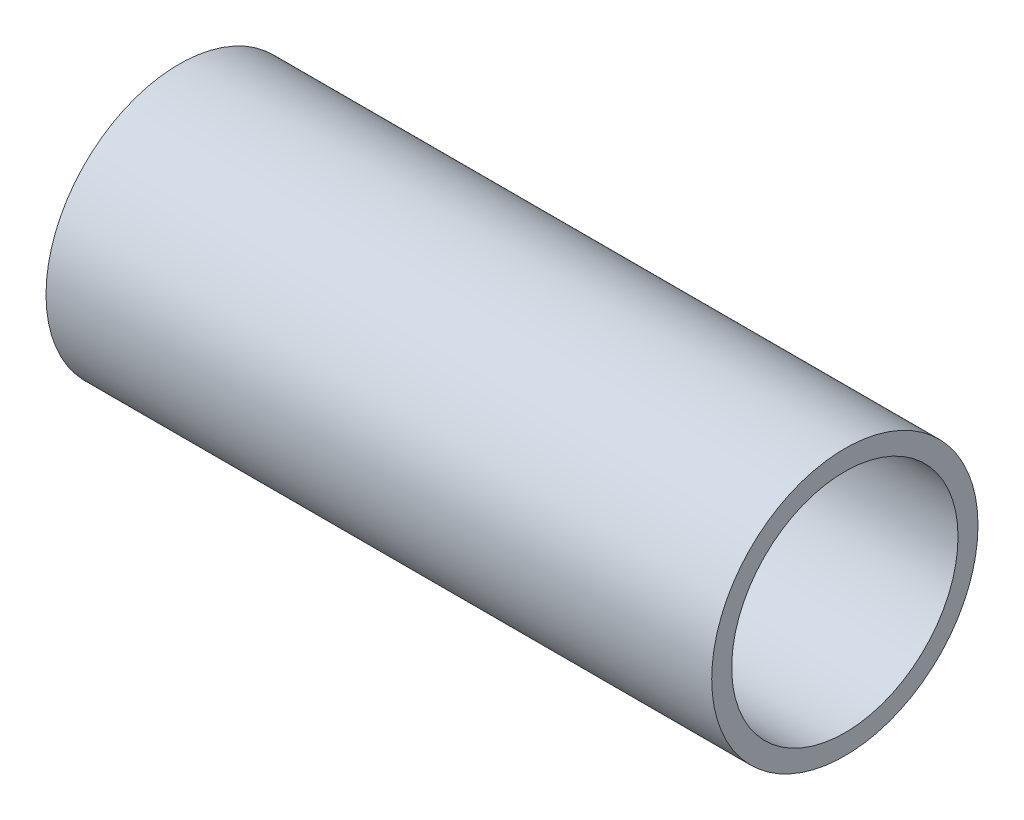
ISO-10303-21;
HEADER;
FILE_DESCRIPTION(('STEP AP214'),'2;1');
FILE_NAME('part.step','',(''),(''),'','','');
FILE_SCHEMA(('AUTOMOTIVE_DESIGN { 1 0 10303 214 1 1 1 1 }'));
ENDSEC;
DATA;
#1=APPLICATION_CONTEXT('core data for automotive mechanical design processes');
#2=APPLICATION_PROTOCOL_DEFINITION('international standard','automotive_design',2000,#1);
#3=PRODUCT_CONTEXT('',#1,'mechanical');
#4=PRODUCT('Part','Part','',(#3));
#5=PRODUCT_RELATED_PRODUCT_CATEGORY('part','',(#4));
#6=PRODUCT_DEFINITION_FORMATION('','',#4);
#7=PRODUCT_DEFINITION_CONTEXT('part definition',#1,'design');
#8=PRODUCT_DEFINITION('design','',#6,#7);
#9=PRODUCT_DEFINITION_SHAPE('','',#8);
#10=(LENGTH_UNIT() NAMED_UNIT(*) SI_UNIT(.MILLI.,.METRE.));
#11=(NAMED_UNIT(*) PLANE_ANGLE_UNIT() SI_UNIT($,.RADIAN.));
#12=(NAMED_UNIT(*) SI_UNIT($,.STERADIAN.) SOLID_ANGLE_UNIT());
#13=UNCERTAINTY_MEASURE_WITH_UNIT(LENGTH_MEASURE(1.E-05),#10,'distance_accuracy_value','');
#14=(GEOMETRIC_REPRESENTATION_CONTEXT(3) GLOBAL_UNCERTAINTY_ASSIGNED_CONTEXT((#13)) GLOBAL_UNIT_ASSIGNED_CONTEXT((#10,
#11,#12)) REPRESENTATION_CONTEXT('',''));
#15=CARTESIAN_POINT('',(0.,0.,0.));
#16=DIRECTION('',(0.,0.,1.));
#17=DIRECTION('',(1.,0.,0.));
#18=AXIS2_PLACEMENT_3D('',#15,#16,#17);
#19=CARTESIAN_POINT('',(100.,0.,0.));
#20=DIRECTION('',(-1.,0.,0.));
#21=DIRECTION('',(0.,0.,1.));
#22=AXIS2_PLACEMENT_3D('',#19,#20,#21);
#23=CYLINDRICAL_SURFACE('',#22,20.);
#24=CARTESIAN_POINT('',(100.,0.,0.));
#25=DIRECTION('',(1.,0.,0.));
#26=DIRECTION('',(0.,0.,-1.));
#27=AXIS2_PLACEMENT_3D('',#24,#25,#26);
#28=CIRCLE('',#27,20.);
#29=CARTESIAN_POINT('',(100.,0.,-20.));
#30=VERTEX_POINT('',#29);
#31=EDGE_CURVE('E10',#30,#30,#28,.T.);
#32=ORIENTED_EDGE('',*,*,#31,.F.);
#33=EDGE_LOOP('',(#32));
#34=FACE_BOUND('',#33,.T.);
#35=CARTESIAN_POINT('',(0.,0.,0.));
#36=DIRECTION('',(1.,0.,0.));
#37=DIRECTION('',(0.,0.,-1.));
#38=AXIS2_PLACEMENT_3D('',#35,#36,#37);
#39=CIRCLE('',#38,20.);
#40=CARTESIAN_POINT('',(0.,0.,-20.));
#41=VERTEX_POINT('',#40);
#42=EDGE_CURVE('E34',#41,#41,#39,.T.);
#43=ORIENTED_EDGE('',*,*,#42,.T.);
#44=EDGE_LOOP('',(#43));
#45=FACE_BOUND('',#44,.T.);
#46=ADVANCED_FACE('F31',(#34,#45),#23,.T.);
#47=CARTESIAN_POINT('',(100.,0.,0.));
#48=DIRECTION('',(1.,0.,0.));
#49=DIRECTION('',(0.,0.,-1.));
#50=AXIS2_PLACEMENT_3D('',#47,#48,#49);
#51=PLANE('',#50);
#52=CARTESIAN_POINT('',(100.,0.,0.));
#53=DIRECTION('',(1.,0.,0.));
#54=DIRECTION('',(0.,0.,-1.));
#55=AXIS2_PLACEMENT_3D('',#52,#53,#54);
#56=CIRCLE('',#55,17.);
#57=CARTESIAN_POINT('',(100.,0.,-17.));
#58=VERTEX_POINT('',#57);
#59=EDGE_CURVE('E43',#58,#58,#56,.T.);
#60=ORIENTED_EDGE('',*,*,#59,.F.);
#61=EDGE_LOOP('',(#60));
#62=FACE_BOUND('',#61,.T.);
#63=ORIENTED_EDGE('',*,*,#31,.T.);
#64=EDGE_LOOP('',(#63));
#65=FACE_BOUND('',#64,.T.);
#66=ADVANCED_FACE('F58',(#62,#65),#51,.T.);
#67=CARTESIAN_POINT('',(0.,0.,0.));
#68=DIRECTION('',(1.,0.,0.));
#69=DIRECTION('',(0.,0.,-1.));
#70=AXIS2_PLACEMENT_3D('',#67,#68,#69);
#71=PLANE('',#70);
#72=ORIENTED_EDGE('',*,*,#42,.F.);
#73=EDGE_LOOP('',(#72));
#74=FACE_BOUND('',#73,.T.);
#75=ADVANCED_FACE('F54',(#74),#71,.F.);
#76=CARTESIAN_POINT('',(5.,0.,0.));
#77=DIRECTION('',(1.,0.,0.));
#78=DIRECTION('',(0.,0.,-1.));
#79=AXIS2_PLACEMENT_3D('',#76,#77,#78);
#80=CYLINDRICAL_SURFACE('',#79,17.);
#81=CARTESIAN_POINT('',(5.,0.,0.));
#82=DIRECTION('',(1.,0.,0.));
#83=DIRECTION('',(0.,0.,-1.));
#84=AXIS2_PLACEMENT_3D('',#81,#82,#83);
#85=CIRCLE('',#84,17.);
#86=CARTESIAN_POINT('',(5.,0.,-17.));
#87=VERTEX_POINT('',#86);
#88=EDGE_CURVE('E41',#87,#87,#85,.T.);
#89=ORIENTED_EDGE('',*,*,#88,.F.);
#90=EDGE_LOOP('',(#89));
#91=FACE_BOUND('',#90,.T.);
#92=ORIENTED_EDGE('',*,*,#59,.T.);
#93=EDGE_LOOP('',(#92));
#94=FACE_BOUND('',#93,.T.);
#95=ADVANCED_FACE('F51',(#91,#94),#80,.F.);
#96=CARTESIAN_POINT('',(5.,0.,0.));
#97=DIRECTION('',(1.,0.,0.));
#98=DIRECTION('',(0.,0.,-1.));
#99=AXIS2_PLACEMENT_3D('',#96,#97,#98);
#100=PLANE('',#99);
#101=ORIENTED_EDGE('',*,*,#88,.T.);
#102=EDGE_LOOP('',(#101));
#103=FACE_BOUND('',#102,.T.);
#104=ADVANCED_FACE('F49',(#103),#100,.T.);
#105=CLOSED_SHELL('',(#46,#66,#75,#95,#104));
#106=MANIFOLD_SOLID_BREP('B2',#105);
#107=ADVANCED_BREP_SHAPE_REPRESENTATION('',(#18,#106),#14);
#108=SHAPE_DEFINITION_REPRESENTATION(#9,#107);
ENDSEC;
END-ISO-10303-21;
